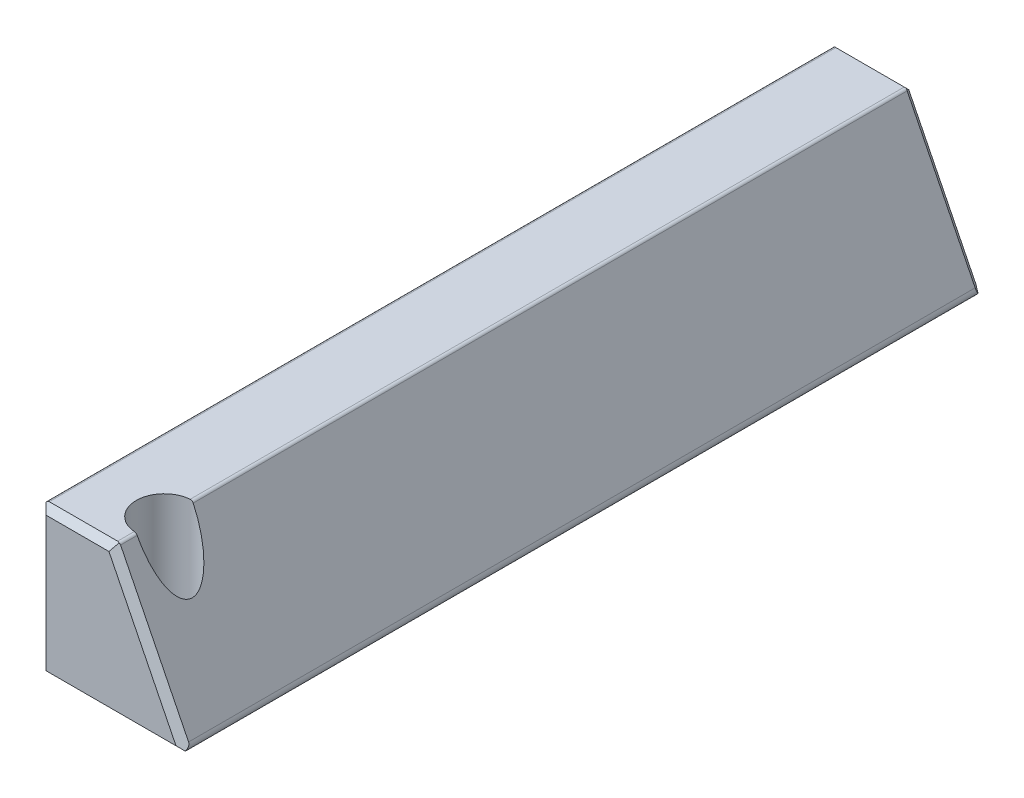
ISO-10303-21;
HEADER;
FILE_DESCRIPTION(('STEP AP214'),'2;1');
FILE_NAME('part.step','',(''),(''),'','','');
FILE_SCHEMA(('AUTOMOTIVE_DESIGN { 1 0 10303 214 1 1 1 1 }'));
ENDSEC;
DATA;
#1=APPLICATION_CONTEXT('core data for automotive mechanical design processes');
#2=APPLICATION_PROTOCOL_DEFINITION('international standard','automotive_design',2000,#1);
#3=PRODUCT_CONTEXT('',#1,'mechanical');
#4=PRODUCT('Part','Part','',(#3));
#5=PRODUCT_RELATED_PRODUCT_CATEGORY('part','',(#4));
#6=PRODUCT_DEFINITION_FORMATION('','',#4);
#7=PRODUCT_DEFINITION_CONTEXT('part definition',#1,'design');
#8=PRODUCT_DEFINITION('design','',#6,#7);
#9=PRODUCT_DEFINITION_SHAPE('','',#8);
#10=(LENGTH_UNIT() NAMED_UNIT(*) SI_UNIT(.MILLI.,.METRE.));
#11=(NAMED_UNIT(*) PLANE_ANGLE_UNIT() SI_UNIT($,.RADIAN.));
#12=(NAMED_UNIT(*) SI_UNIT($,.STERADIAN.) SOLID_ANGLE_UNIT());
#13=UNCERTAINTY_MEASURE_WITH_UNIT(LENGTH_MEASURE(1.E-05),#10,'distance_accuracy_value','');
#14=(GEOMETRIC_REPRESENTATION_CONTEXT(3) GLOBAL_UNCERTAINTY_ASSIGNED_CONTEXT((#13)) GLOBAL_UNIT_ASSIGNED_CONTEXT((#10,
#11,#12)) REPRESENTATION_CONTEXT('',''));
#15=CARTESIAN_POINT('',(0.,0.,0.));
#16=DIRECTION('',(0.,0.,1.));
#17=DIRECTION('',(1.,0.,0.));
#18=AXIS2_PLACEMENT_3D('',#15,#16,#17);
#19=CARTESIAN_POINT('',(5.39518119490849,10.9,60.25));
#20=DIRECTION('',(0.,0.,-1.));
#21=DIRECTION('',(-1.,0.,0.));
#22=AXIS2_PLACEMENT_3D('',#19,#20,#21);
#23=CYLINDRICAL_SURFACE('',#22,0.25);
#24=CARTESIAN_POINT('',(5.61898835620415,11.0114017708691,54.2811281198925));
#25=CARTESIAN_POINT('',(5.61273756244487,11.0239863047052,54.2809243798264));
#26=CARTESIAN_POINT('',(5.60540711729358,11.0360296758708,54.2807114801354));
#27=CARTESIAN_POINT('',(5.58884381534372,11.0587143618956,54.2803411660567));
#28=CARTESIAN_POINT('',(5.5796125467566,11.0693568351677,54.2801837056431));
#29=CARTESIAN_POINT('',(5.55948873102792,11.0889463722493,54.2799974487603));
#30=CARTESIAN_POINT('',(5.54859543904155,11.0978926718579,54.2799687101547));
#31=CARTESIAN_POINT('',(5.5254615316477,11.1138322177729,54.2801110346833));
#32=CARTESIAN_POINT('',(5.51322071703151,11.1208251747682,54.2802821273952));
#33=CARTESIAN_POINT('',(5.4877692770646,11.1326458964287,54.2808795231473));
#34=CARTESIAN_POINT('',(5.47456050955014,11.137477688678,54.2813053479715));
#35=CARTESIAN_POINT('',(5.44754755129671,11.1448531933859,54.2824457905319));
#36=CARTESIAN_POINT('',(5.43374425087326,11.1474002104603,54.2831599889981));
#37=CARTESIAN_POINT('',(5.41164206903695,11.149594976489,54.2845245651528));
#38=CARTESIAN_POINT('',(5.40340740909993,11.1500033691288,54.2850809899192));
#39=CARTESIAN_POINT('',(5.39518119490849,11.15,54.2856874905114));
#40=B_SPLINE_CURVE_WITH_KNOTS('',3,(#24,#25,#26,#27,#28,#29,#30,#31,#32,#33,#34,#35,#36,#37,#38,
#39),.UNSPECIFIED.,.F.,.F.,(4,2,2,2,2,2,2,4),(0.,0.04210341287999,0.0841717884491808,
0.12625907286941,0.168352587568771,0.210367325836084,0.252321197070489,0.277068942626386),.UNSPECIFIED.);
#41=CARTESIAN_POINT('',(5.61898835620415,11.0114017708691,54.2811281198925));
#42=VERTEX_POINT('',#41);
#43=CARTESIAN_POINT('',(5.39518119490849,11.15,54.2856874905114));
#44=VERTEX_POINT('',#43);
#45=EDGE_CURVE('E14',#42,#44,#40,.T.);
#46=ORIENTED_EDGE('',*,*,#45,.F.);
#47=DIRECTION('',(0.,0.,-1.));
#48=VECTOR('',#47,1.);
#49=CARTESIAN_POINT('',(5.61898835620415,11.0114017708691,60.25));
#50=LINE('',#49,#48);
#51=CARTESIAN_POINT('',(5.61898835620415,11.0114017708691,0.5));
#52=VERTEX_POINT('',#51);
#53=EDGE_CURVE('E216',#52,#42,#50,.F.);
#54=ORIENTED_EDGE('',*,*,#53,.F.);
#55=CARTESIAN_POINT('',(5.39518119490849,10.9,0.25));
#56=DIRECTION('',(-0.633022245721076,-0.315091790471029,0.707106781186552));
#57=DIRECTION('',(-0.633022245721084,-0.315091790471033,-0.707106781186543));
#58=AXIS2_PLACEMENT_3D('',#55,#56,#57);
#59=ELLIPSE('',#58,0.353553390593272,0.25);
#60=CARTESIAN_POINT('',(5.52680481984474,11.1125446338034,0.462544633803449));
#61=VERTEX_POINT('',#60);
#62=EDGE_CURVE('E212',#61,#52,#59,.F.);
#63=ORIENTED_EDGE('',*,*,#62,.F.);
#64=CARTESIAN_POINT('',(5.39518119490849,10.9,0.25));
#65=DIRECTION('',(0.,-0.707106781186542,0.707106781186552));
#66=DIRECTION('',(0.,-0.707106781186552,-0.707106781186543));
#67=AXIS2_PLACEMENT_3D('',#64,#65,#66);
#68=ELLIPSE('',#67,0.353553390593271,0.25);
#69=CARTESIAN_POINT('',(5.39518119490849,11.15,0.5));
#70=VERTEX_POINT('',#69);
#71=EDGE_CURVE('E199',#70,#61,#68,.F.);
#72=ORIENTED_EDGE('',*,*,#71,.F.);
#73=DIRECTION('',(0.,0.,-1.));
#74=VECTOR('',#73,1.);
#75=CARTESIAN_POINT('',(5.39518119490849,11.15,60.25));
#76=LINE('',#75,#74);
#77=EDGE_CURVE('E191',#44,#70,#76,.T.);
#78=ORIENTED_EDGE('',*,*,#77,.F.);
#79=EDGE_LOOP('',(#46,#54,#63,#72,#78));
#80=FACE_BOUND('',#79,.T.);
#81=ADVANCED_FACE('F51',(#80),#23,.T.);
#82=CARTESIAN_POINT('',(5.55,11.15,60.25));
#83=DIRECTION('',(0.,-1.,0.));
#84=DIRECTION('',(1.,0.,0.));
#85=AXIS2_PLACEMENT_3D('',#82,#83,#84);
#86=PLANE('',#85);
#87=CARTESIAN_POINT('',(5.39518119490849,11.15,59.75));
#88=VERTEX_POINT('',#87);
#89=CARTESIAN_POINT('',(5.39518119490849,11.15,58.4943125094886));
#90=VERTEX_POINT('',#89);
#91=EDGE_CURVE('E195',#88,#90,#76,.T.);
#92=ORIENTED_EDGE('',*,*,#91,.T.);
#93=CARTESIAN_POINT('',(5.55,11.15,56.39));
#94=DIRECTION('',(0.,1.,0.));
#95=DIRECTION('',(-1.,0.,0.));
#96=AXIS2_PLACEMENT_3D('',#93,#94,#95);
#97=CIRCLE('',#96,2.11);
#98=EDGE_CURVE('E69',#44,#90,#97,.T.);
#99=ORIENTED_EDGE('',*,*,#98,.F.);
#100=ORIENTED_EDGE('',*,*,#77,.T.);
#101=DIRECTION('',(-1.,0.,0.));
#102=VECTOR('',#101,1.);
#103=CARTESIAN_POINT('',(5.55,11.15,0.5));
#104=LINE('',#103,#102);
#105=CARTESIAN_POINT('',(0.250000000000005,11.15,0.5));
#106=VERTEX_POINT('',#105);
#107=EDGE_CURVE('E421',#70,#106,#104,.T.);
#108=ORIENTED_EDGE('',*,*,#107,.T.);
#109=DIRECTION('',(0.,0.,-1.));
#110=VECTOR('',#109,1.);
#111=CARTESIAN_POINT('',(0.250000000000005,11.15,60.25));
#112=LINE('',#111,#110);
#113=CARTESIAN_POINT('',(0.250000000000005,11.15,59.75));
#114=VERTEX_POINT('',#113);
#115=EDGE_CURVE('E203',#106,#114,#112,.F.);
#116=ORIENTED_EDGE('',*,*,#115,.T.);
#117=DIRECTION('',(1.,0.,0.));
#118=VECTOR('',#117,1.);
#119=CARTESIAN_POINT('',(5.55,11.15,59.75));
#120=LINE('',#119,#118);
#121=EDGE_CURVE('E413',#114,#88,#120,.T.);
#122=ORIENTED_EDGE('',*,*,#121,.T.);
#123=EDGE_LOOP('',(#92,#99,#100,#108,#116,#122));
#124=FACE_BOUND('',#123,.T.);
#125=ADVANCED_FACE('F189',(#124),#86,.F.);
#126=CARTESIAN_POINT('',(0.,11.15,60.25));
#127=DIRECTION('',(1.,0.,0.));
#128=DIRECTION('',(0.,1.,0.));
#129=AXIS2_PLACEMENT_3D('',#126,#127,#128);
#130=PLANE('',#129);
#131=DIRECTION('',(0.,-1.,0.));
#132=VECTOR('',#131,1.);
#133=CARTESIAN_POINT('',(0.,11.15,0.5));
#134=LINE('',#133,#132);
#135=CARTESIAN_POINT('',(0.,10.9,0.5));
#136=VERTEX_POINT('',#135);
#137=CARTESIAN_POINT('',(0.,0.25,0.5));
#138=VERTEX_POINT('',#137);
#139=EDGE_CURVE('E501',#136,#138,#134,.T.);
#140=ORIENTED_EDGE('',*,*,#139,.T.);
#141=DIRECTION('',(0.,0.,-1.));
#142=VECTOR('',#141,1.);
#143=CARTESIAN_POINT('',(0.,0.25,60.25));
#144=LINE('',#143,#142);
#145=CARTESIAN_POINT('',(0.,0.25,59.75));
#146=VERTEX_POINT('',#145);
#147=EDGE_CURVE('E464',#138,#146,#144,.F.);
#148=ORIENTED_EDGE('',*,*,#147,.T.);
#149=DIRECTION('',(0.,1.,0.));
#150=VECTOR('',#149,1.);
#151=CARTESIAN_POINT('',(0.,11.15,59.75));
#152=LINE('',#151,#150);
#153=CARTESIAN_POINT('',(0.,10.9,59.75));
#154=VERTEX_POINT('',#153);
#155=EDGE_CURVE('E445',#146,#154,#152,.T.);
#156=ORIENTED_EDGE('',*,*,#155,.T.);
#157=DIRECTION('',(0.,0.,-1.));
#158=VECTOR('',#157,1.);
#159=CARTESIAN_POINT('',(0.,10.9,60.25));
#160=LINE('',#159,#158);
#161=EDGE_CURVE('E461',#154,#136,#160,.T.);
#162=ORIENTED_EDGE('',*,*,#161,.T.);
#163=EDGE_LOOP('',(#140,#148,#156,#162));
#164=FACE_BOUND('',#163,.T.);
#165=ADVANCED_FACE('F257',(#164),#130,.F.);
#166=CARTESIAN_POINT('',(0.,0.,60.25));
#167=DIRECTION('',(0.,1.,0.));
#168=DIRECTION('',(0.,0.,1.));
#169=AXIS2_PLACEMENT_3D('',#166,#167,#168);
#170=PLANE('',#169);
#171=CARTESIAN_POINT('',(5.55000000000001,0.,56.39));
#172=DIRECTION('',(0.,1.,0.));
#173=DIRECTION('',(-1.,0.,0.));
#174=AXIS2_PLACEMENT_3D('',#171,#172,#173);
#175=CIRCLE('',#174,2.11);
#176=CARTESIAN_POINT('',(3.44000000000001,0.,56.39));
#177=VERTEX_POINT('',#176);
#178=EDGE_CURVE('E196',#177,#177,#175,.T.);
#179=ORIENTED_EDGE('',*,*,#178,.T.);
#180=EDGE_LOOP('',(#179));
#181=FACE_BOUND('',#180,.T.);
#182=DIRECTION('',(1.,0.,0.));
#183=VECTOR('',#182,1.);
#184=CARTESIAN_POINT('',(0.,0.,0.5));
#185=LINE('',#184,#183);
#186=CARTESIAN_POINT('',(0.25,0.,0.5));
#187=VERTEX_POINT('',#186);
#188=CARTESIAN_POINT('',(10.2926045422834,0.,0.5));
#189=VERTEX_POINT('',#188);
#190=EDGE_CURVE('E411',#187,#189,#185,.T.);
#191=ORIENTED_EDGE('',*,*,#190,.T.);
#192=DIRECTION('',(0.,0.,-1.));
#193=VECTOR('',#192,1.);
#194=CARTESIAN_POINT('',(10.2926045422834,0.,60.25));
#195=LINE('',#194,#193);
#196=CARTESIAN_POINT('',(10.2926045422834,0.,59.75));
#197=VERTEX_POINT('',#196);
#198=EDGE_CURVE('E227',#189,#197,#195,.F.);
#199=ORIENTED_EDGE('',*,*,#198,.T.);
#200=DIRECTION('',(-1.,0.,0.));
#201=VECTOR('',#200,1.);
#202=CARTESIAN_POINT('',(0.,0.,59.75));
#203=LINE('',#202,#201);
#204=CARTESIAN_POINT('',(0.25,0.,59.75));
#205=VERTEX_POINT('',#204);
#206=EDGE_CURVE('E416',#197,#205,#203,.T.);
#207=ORIENTED_EDGE('',*,*,#206,.T.);
#208=DIRECTION('',(0.,0.,-1.));
#209=VECTOR('',#208,1.);
#210=CARTESIAN_POINT('',(0.25,0.,60.25));
#211=LINE('',#210,#209);
#212=EDGE_CURVE('E433',#205,#187,#211,.T.);
#213=ORIENTED_EDGE('',*,*,#212,.T.);
#214=EDGE_LOOP('',(#191,#199,#207,#213));
#215=FACE_BOUND('',#214,.T.);
#216=ADVANCED_FACE('F253',(#181,#215),#170,.F.);
#217=CARTESIAN_POINT('',(11.1,0.,60.25));
#218=DIRECTION('',(-0.895228645182626,-0.445607083476554,0.));
#219=DIRECTION('',(0.445607083476554,-0.895228645182626,0.));
#220=AXIS2_PLACEMENT_3D('',#217,#218,#219);
#221=PLANE('',#220);
#222=ORIENTED_EDGE('',*,*,#53,.T.);
#223=CARTESIAN_POINT('',(5.55,11.15,56.39));
#224=DIRECTION('',(-0.895228645182626,-0.445607083476554,0.));
#225=DIRECTION('',(-0.445607083476554,0.895228645182626,0.));
#226=AXIS2_PLACEMENT_3D('',#223,#224,#225);
#227=ELLIPSE('',#226,4.73511323818761,2.11);
#228=CARTESIAN_POINT('',(5.61898835620415,11.0114017708691,58.4988718801075));
#229=VERTEX_POINT('',#228);
#230=EDGE_CURVE('E182',#42,#229,#227,.T.);
#231=ORIENTED_EDGE('',*,*,#230,.T.);
#232=CARTESIAN_POINT('',(5.61898835620415,11.0114017708691,59.75));
#233=VERTEX_POINT('',#232);
#234=EDGE_CURVE('E215',#229,#233,#50,.F.);
#235=ORIENTED_EDGE('',*,*,#234,.T.);
#236=DIRECTION('',(0.445607083476554,-0.895228645182626,0.));
#237=VECTOR('',#236,1.);
#238=CARTESIAN_POINT('',(11.1,0.,59.75));
#239=LINE('',#238,#237);
#240=CARTESIAN_POINT('',(10.7402188648747,0.722803541738277,59.75));
#241=VERTEX_POINT('',#240);
#242=EDGE_CURVE('E404',#233,#241,#239,.T.);
#243=ORIENTED_EDGE('',*,*,#242,.T.);
#244=DIRECTION('',(0.,0.,-1.));
#245=VECTOR('',#244,1.);
#246=CARTESIAN_POINT('',(10.7402188648747,0.722803541738277,60.25));
#247=LINE('',#246,#245);
#248=CARTESIAN_POINT('',(10.7402188648747,0.722803541738277,0.5));
#249=VERTEX_POINT('',#248);
#250=EDGE_CURVE('E220',#241,#249,#247,.T.);
#251=ORIENTED_EDGE('',*,*,#250,.T.);
#252=DIRECTION('',(-0.445607083476554,0.895228645182626,0.));
#253=VECTOR('',#252,1.);
#254=CARTESIAN_POINT('',(11.1,0.,0.5));
#255=LINE('',#254,#253);
#256=EDGE_CURVE('E410',#249,#52,#255,.T.);
#257=ORIENTED_EDGE('',*,*,#256,.T.);
#258=EDGE_LOOP('',(#222,#231,#235,#243,#251,#257));
#259=FACE_BOUND('',#258,.T.);
#260=ADVANCED_FACE('F245',(#259),#221,.F.);
#261=CARTESIAN_POINT('',(0.,0.,60.25));
#262=DIRECTION('',(0.,0.,1.));
#263=DIRECTION('',(1.,0.,0.));
#264=AXIS2_PLACEMENT_3D('',#261,#262,#263);
#265=PLANE('',#264);
#266=DIRECTION('',(1.,0.,0.));
#267=VECTOR('',#266,1.);
#268=CARTESIAN_POINT('',(11.1,0.5,60.25));
#269=LINE('',#268,#267);
#270=CARTESIAN_POINT('',(0.500000000000001,0.5,60.25));
#271=VERTEX_POINT('',#270);
#272=CARTESIAN_POINT('',(10.2926045422834,0.5,60.25));
#273=VERTEX_POINT('',#272);
#274=EDGE_CURVE('E428',#271,#273,#269,.T.);
#275=ORIENTED_EDGE('',*,*,#274,.T.);
#276=DIRECTION('',(-0.445607083476554,0.895228645182626,0.));
#277=VECTOR('',#276,1.);
#278=CARTESIAN_POINT('',(5.10238567740869,10.9271964582617,60.25));
#279=LINE('',#278,#277);
#280=CARTESIAN_POINT('',(5.24036238981699,10.65,60.25));
#281=VERTEX_POINT('',#280);
#282=EDGE_CURVE('E430',#273,#281,#279,.T.);
#283=ORIENTED_EDGE('',*,*,#282,.T.);
#284=DIRECTION('',(-1.,0.,0.));
#285=VECTOR('',#284,1.);
#286=CARTESIAN_POINT('',(0.,10.65,60.25));
#287=LINE('',#286,#285);
#288=CARTESIAN_POINT('',(0.500000000000006,10.65,60.25));
#289=VERTEX_POINT('',#288);
#290=EDGE_CURVE('E423',#281,#289,#287,.T.);
#291=ORIENTED_EDGE('',*,*,#290,.T.);
#292=DIRECTION('',(0.,-1.,0.));
#293=VECTOR('',#292,1.);
#294=CARTESIAN_POINT('',(0.5,0.,60.25));
#295=LINE('',#294,#293);
#296=EDGE_CURVE('E426',#289,#271,#295,.T.);
#297=ORIENTED_EDGE('',*,*,#296,.T.);
#298=EDGE_LOOP('',(#275,#283,#291,#297));
#299=FACE_BOUND('',#298,.T.);
#300=ADVANCED_FACE('F240',(#299),#265,.T.);
#301=CARTESIAN_POINT('',(0.,0.,0.));
#302=DIRECTION('',(0.,0.,1.));
#303=DIRECTION('',(1.,0.,0.));
#304=AXIS2_PLACEMENT_3D('',#301,#302,#303);
#305=PLANE('',#304);
#306=DIRECTION('',(-1.,0.,0.));
#307=VECTOR('',#306,1.);
#308=CARTESIAN_POINT('',(0.,0.500000000000007,0.));
#309=LINE('',#308,#307);
#310=CARTESIAN_POINT('',(10.2926045422833,0.500000000000007,0.));
#311=VERTEX_POINT('',#310);
#312=CARTESIAN_POINT('',(0.500000000000008,0.500000000000007,0.));
#313=VERTEX_POINT('',#312);
#314=EDGE_CURVE('E482',#311,#313,#309,.T.);
#315=ORIENTED_EDGE('',*,*,#314,.T.);
#316=DIRECTION('',(0.,1.,0.));
#317=VECTOR('',#316,1.);
#318=CARTESIAN_POINT('',(0.500000000000007,0.,0.));
#319=LINE('',#318,#317);
#320=CARTESIAN_POINT('',(0.500000000000013,10.65,0.));
#321=VERTEX_POINT('',#320);
#322=EDGE_CURVE('E485',#313,#321,#319,.T.);
#323=ORIENTED_EDGE('',*,*,#322,.T.);
#324=DIRECTION('',(1.,0.,0.));
#325=VECTOR('',#324,1.);
#326=CARTESIAN_POINT('',(0.,10.65,0.));
#327=LINE('',#326,#325);
#328=CARTESIAN_POINT('',(5.24036238981698,10.65,0.));
#329=VERTEX_POINT('',#328);
#330=EDGE_CURVE('E488',#321,#329,#327,.T.);
#331=ORIENTED_EDGE('',*,*,#330,.T.);
#332=DIRECTION('',(0.445607083476554,-0.895228645182626,0.));
#333=VECTOR('',#332,1.);
#334=CARTESIAN_POINT('',(8.44830670883495,4.20521096269363,0.));
#335=LINE('',#334,#333);
#336=EDGE_CURVE('E478',#329,#311,#335,.T.);
#337=ORIENTED_EDGE('',*,*,#336,.T.);
#338=EDGE_LOOP('',(#315,#323,#331,#337));
#339=FACE_BOUND('',#338,.T.);
#340=ADVANCED_FACE('F244',(#339),#305,.F.);
#341=CARTESIAN_POINT('',(11.1,0.,0.5));
#342=DIRECTION('',(-0.633022245721076,-0.315091790471029,0.707106781186552));
#343=DIRECTION('',(-0.445607083476554,0.895228645182626,0.));
#344=AXIS2_PLACEMENT_3D('',#341,#342,#343);
#345=PLANE('',#344);
#346=ORIENTED_EDGE('',*,*,#256,.F.);
#347=CARTESIAN_POINT('',(10.2926045422834,0.5,0.));
#348=DIRECTION('',(-0.633022245721076,-0.315091790471029,0.707106781186552));
#349=DIRECTION('',(-0.633022245721084,-0.315091790471033,-0.707106781186543));
#350=AXIS2_PLACEMENT_3D('',#347,#348,#349);
#351=ELLIPSE('',#350,0.707106781186543,0.5);
#352=CARTESIAN_POINT('',(10.7176938098903,0.236752750127508,0.263247249872496));
#353=VERTEX_POINT('',#352);
#354=EDGE_CURVE('E223',#249,#353,#351,.F.);
#355=ORIENTED_EDGE('',*,*,#354,.T.);
#356=DIRECTION('',(-0.752283061319479,0.465870258576247,-0.46587025857624));
#357=VECTOR('',#356,1.);
#358=CARTESIAN_POINT('',(11.1,0.,0.5));
#359=LINE('',#358,#357);
#360=EDGE_CURVE('E440',#311,#353,#359,.F.);
#361=ORIENTED_EDGE('',*,*,#360,.F.);
#362=ORIENTED_EDGE('',*,*,#336,.F.);
#363=DIRECTION('',(-0.401121518355086,-0.647727383824601,-0.647727383824591));
#364=VECTOR('',#363,1.);
#365=CARTESIAN_POINT('',(5.55,11.15,0.500000000000001));
#366=LINE('',#365,#364);
#367=EDGE_CURVE('E443',#61,#329,#366,.T.);
#368=ORIENTED_EDGE('',*,*,#367,.F.);
#369=ORIENTED_EDGE('',*,*,#62,.T.);
#370=EDGE_LOOP('',(#346,#355,#361,#362,#368,#369));
#371=FACE_BOUND('',#370,.T.);
#372=ADVANCED_FACE('F249',(#371),#345,.F.);
#373=CARTESIAN_POINT('',(5.55,11.15,0.5));
#374=DIRECTION('',(0.,-0.707106781186542,0.707106781186552));
#375=DIRECTION('',(-1.,0.,0.));
#376=AXIS2_PLACEMENT_3D('',#373,#374,#375);
#377=PLANE('',#376);
#378=DIRECTION('',(-0.577350269189629,0.577350269189628,0.577350269189621));
#379=VECTOR('',#378,1.);
#380=CARTESIAN_POINT('',(1.85000000000002,9.29999999999998,-1.34999999999999));
#381=LINE('',#380,#379);
#382=CARTESIAN_POINT('',(0.0732233047033689,11.0767766952966,0.426776695296638));
#383=VERTEX_POINT('',#382);
#384=EDGE_CURVE('E437',#383,#321,#381,.F.);
#385=ORIENTED_EDGE('',*,*,#384,.F.);
#386=CARTESIAN_POINT('',(0.250000000000006,10.9,0.25));
#387=DIRECTION('',(0.,-0.707106781186542,0.707106781186552));
#388=DIRECTION('',(0.,-0.707106781186552,-0.707106781186543));
#389=AXIS2_PLACEMENT_3D('',#386,#387,#388);
#390=ELLIPSE('',#389,0.353553390593271,0.25);
#391=EDGE_CURVE('E201',#383,#106,#390,.F.);
#392=ORIENTED_EDGE('',*,*,#391,.T.);
#393=ORIENTED_EDGE('',*,*,#107,.F.);
#394=ORIENTED_EDGE('',*,*,#71,.T.);
#395=ORIENTED_EDGE('',*,*,#367,.T.);
#396=ORIENTED_EDGE('',*,*,#330,.F.);
#397=EDGE_LOOP('',(#385,#392,#393,#394,#395,#396));
#398=FACE_BOUND('',#397,.T.);
#399=ADVANCED_FACE('F272',(#398),#377,.F.);
#400=CARTESIAN_POINT('',(0.,0.,0.5));
#401=DIRECTION('',(0.,0.707106781186542,0.707106781186552));
#402=DIRECTION('',(1.,0.,0.));
#403=AXIS2_PLACEMENT_3D('',#400,#401,#402);
#404=PLANE('',#403);
#405=ORIENTED_EDGE('',*,*,#360,.T.);
#406=CARTESIAN_POINT('',(10.2926045422834,0.5,0.));
#407=DIRECTION('',(0.,0.707106781186542,0.707106781186552));
#408=DIRECTION('',(0.,0.707106781186552,-0.707106781186543));
#409=AXIS2_PLACEMENT_3D('',#406,#407,#408);
#410=ELLIPSE('',#409,0.707106781186543,0.5);
#411=EDGE_CURVE('E225',#353,#189,#410,.F.);
#412=ORIENTED_EDGE('',*,*,#411,.T.);
#413=ORIENTED_EDGE('',*,*,#190,.F.);
#414=CARTESIAN_POINT('',(0.25,0.25,0.25));
#415=DIRECTION('',(0.,0.707106781186542,0.707106781186552));
#416=DIRECTION('',(0.,0.707106781186552,-0.707106781186543));
#417=AXIS2_PLACEMENT_3D('',#414,#415,#416);
#418=ELLIPSE('',#417,0.353553390593271,0.25);
#419=CARTESIAN_POINT('',(0.0732233047033642,0.0732233047033641,0.426776695296637));
#420=VERTEX_POINT('',#419);
#421=EDGE_CURVE('E455',#187,#420,#418,.F.);
#422=ORIENTED_EDGE('',*,*,#421,.T.);
#423=DIRECTION('',(0.577350269189629,0.577350269189628,-0.57735026918962));
#424=VECTOR('',#423,1.);
#425=CARTESIAN_POINT('',(0.,0.,0.5));
#426=LINE('',#425,#424);
#427=EDGE_CURVE('E434',#313,#420,#426,.F.);
#428=ORIENTED_EDGE('',*,*,#427,.F.);
#429=ORIENTED_EDGE('',*,*,#314,.F.);
#430=EDGE_LOOP('',(#405,#412,#413,#422,#428,#429));
#431=FACE_BOUND('',#430,.T.);
#432=ADVANCED_FACE('F268',(#431),#404,.F.);
#433=CARTESIAN_POINT('',(0.,11.15,0.5));
#434=DIRECTION('',(0.707106781186542,0.,0.707106781186552));
#435=DIRECTION('',(0.,-1.,0.));
#436=AXIS2_PLACEMENT_3D('',#433,#434,#435);
#437=PLANE('',#436);
#438=ORIENTED_EDGE('',*,*,#427,.T.);
#439=CARTESIAN_POINT('',(0.25,0.25,0.25));
#440=DIRECTION('',(0.707106781186542,0.,0.707106781186552));
#441=DIRECTION('',(0.707106781186552,0.,-0.707106781186543));
#442=AXIS2_PLACEMENT_3D('',#439,#440,#441);
#443=ELLIPSE('',#442,0.353553390593271,0.25);
#444=EDGE_CURVE('E459',#420,#138,#443,.F.);
#445=ORIENTED_EDGE('',*,*,#444,.T.);
#446=ORIENTED_EDGE('',*,*,#139,.F.);
#447=CARTESIAN_POINT('',(0.250000000000006,10.9,0.25));
#448=DIRECTION('',(0.707106781186542,0.,0.707106781186552));
#449=DIRECTION('',(0.707106781186552,0.,-0.707106781186543));
#450=AXIS2_PLACEMENT_3D('',#447,#448,#449);
#451=ELLIPSE('',#450,0.353553390593271,0.25);
#452=EDGE_CURVE('E457',#136,#383,#451,.F.);
#453=ORIENTED_EDGE('',*,*,#452,.T.);
#454=ORIENTED_EDGE('',*,*,#384,.T.);
#455=ORIENTED_EDGE('',*,*,#322,.F.);
#456=EDGE_LOOP('',(#438,#445,#446,#453,#454,#455));
#457=FACE_BOUND('',#456,.T.);
#458=ADVANCED_FACE('F264',(#457),#437,.F.);
#459=CARTESIAN_POINT('',(0.5,0.,60.25));
#460=DIRECTION('',(-0.707106781186552,0.,0.707106781186542));
#461=DIRECTION('',(0.,1.,0.));
#462=AXIS2_PLACEMENT_3D('',#459,#460,#461);
#463=PLANE('',#462);
#464=ORIENTED_EDGE('',*,*,#155,.F.);
#465=CARTESIAN_POINT('',(0.25,0.25,60.));
#466=DIRECTION('',(-0.707106781186552,0.,0.707106781186542));
#467=DIRECTION('',(-0.707106781186543,0.,-0.707106781186552));
#468=AXIS2_PLACEMENT_3D('',#465,#466,#467);
#469=ELLIPSE('',#468,0.353553390593276,0.25);
#470=CARTESIAN_POINT('',(0.0732233047033625,0.0732233047033624,59.8232233047034));
#471=VERTEX_POINT('',#470);
#472=EDGE_CURVE('E468',#146,#471,#469,.T.);
#473=ORIENTED_EDGE('',*,*,#472,.T.);
#474=DIRECTION('',(0.577350269189623,0.577350269189623,0.577350269189631));
#475=VECTOR('',#474,1.);
#476=CARTESIAN_POINT('',(0.333333333333335,0.333333333333335,60.0833333333333));
#477=LINE('',#476,#475);
#478=EDGE_CURVE('E438',#271,#471,#477,.F.);
#479=ORIENTED_EDGE('',*,*,#478,.F.);
#480=ORIENTED_EDGE('',*,*,#296,.F.);
#481=DIRECTION('',(0.577350269189623,-0.577350269189623,0.577350269189631));
#482=VECTOR('',#481,1.);
#483=CARTESIAN_POINT('',(0.333333333333337,10.8166666666667,60.0833333333333));
#484=LINE('',#483,#482);
#485=CARTESIAN_POINT('',(0.0732233047033665,11.0767766952966,59.8232233047034));
#486=VERTEX_POINT('',#485);
#487=EDGE_CURVE('E449',#486,#289,#484,.T.);
#488=ORIENTED_EDGE('',*,*,#487,.F.);
#489=CARTESIAN_POINT('',(0.250000000000006,10.9,60.));
#490=DIRECTION('',(-0.707106781186552,0.,0.707106781186542));
#491=DIRECTION('',(-0.707106781186543,0.,-0.707106781186552));
#492=AXIS2_PLACEMENT_3D('',#489,#490,#491);
#493=ELLIPSE('',#492,0.353553390593276,0.25);
#494=EDGE_CURVE('E466',#486,#154,#493,.T.);
#495=ORIENTED_EDGE('',*,*,#494,.T.);
#496=EDGE_LOOP('',(#464,#473,#479,#480,#488,#495));
#497=FACE_BOUND('',#496,.T.);
#498=ADVANCED_FACE('F267',(#497),#463,.T.);
#499=CARTESIAN_POINT('',(0.,0.5,60.25));
#500=DIRECTION('',(0.,-0.707106781186552,0.707106781186542));
#501=DIRECTION('',(-1.,0.,0.));
#502=AXIS2_PLACEMENT_3D('',#499,#500,#501);
#503=PLANE('',#502);
#504=ORIENTED_EDGE('',*,*,#206,.F.);
#505=CARTESIAN_POINT('',(10.2926045422834,0.5,60.25));
#506=DIRECTION('',(0.,-0.707106781186552,0.707106781186542));
#507=DIRECTION('',(0.,-0.707106781186543,-0.707106781186552));
#508=AXIS2_PLACEMENT_3D('',#505,#506,#507);
#509=ELLIPSE('',#508,0.707106781186553,0.5);
#510=CARTESIAN_POINT('',(10.7176938098903,0.236752750127508,59.9867527501275));
#511=VERTEX_POINT('',#510);
#512=EDGE_CURVE('E77',#197,#511,#509,.T.);
#513=ORIENTED_EDGE('',*,*,#512,.T.);
#514=DIRECTION('',(-0.752283061319475,0.465870258576244,0.465870258576251));
#515=VECTOR('',#514,1.);
#516=CARTESIAN_POINT('',(4.46771286743554,4.1072110755496,63.8572110755496));
#517=LINE('',#516,#515);
#518=EDGE_CURVE('E407',#273,#511,#517,.F.);
#519=ORIENTED_EDGE('',*,*,#518,.F.);
#520=ORIENTED_EDGE('',*,*,#274,.F.);
#521=ORIENTED_EDGE('',*,*,#478,.T.);
#522=CARTESIAN_POINT('',(0.25,0.25,60.));
#523=DIRECTION('',(0.,-0.707106781186552,0.707106781186542));
#524=DIRECTION('',(0.,-0.707106781186543,-0.707106781186552));
#525=AXIS2_PLACEMENT_3D('',#522,#523,#524);
#526=ELLIPSE('',#525,0.353553390593276,0.25);
#527=EDGE_CURVE('E470',#471,#205,#526,.T.);
#528=ORIENTED_EDGE('',*,*,#527,.T.);
#529=EDGE_LOOP('',(#504,#513,#519,#520,#521,#528));
#530=FACE_BOUND('',#529,.T.);
#531=ADVANCED_FACE('F288',(#530),#503,.T.);
#532=CARTESIAN_POINT('',(0.,10.65,60.25));
#533=DIRECTION('',(0.,0.707106781186552,0.707106781186542));
#534=DIRECTION('',(1.,0.,0.));
#535=AXIS2_PLACEMENT_3D('',#532,#533,#534);
#536=PLANE('',#535);
#537=ORIENTED_EDGE('',*,*,#121,.F.);
#538=CARTESIAN_POINT('',(0.250000000000006,10.9,60.));
#539=DIRECTION('',(0.,0.707106781186552,0.707106781186542));
#540=DIRECTION('',(0.,0.707106781186543,-0.707106781186552));
#541=AXIS2_PLACEMENT_3D('',#538,#539,#540);
#542=ELLIPSE('',#541,0.353553390593276,0.25);
#543=EDGE_CURVE('E210',#114,#486,#542,.T.);
#544=ORIENTED_EDGE('',*,*,#543,.T.);
#545=ORIENTED_EDGE('',*,*,#487,.T.);
#546=ORIENTED_EDGE('',*,*,#290,.F.);
#547=DIRECTION('',(0.40112151835508,0.647727383824593,-0.647727383824602));
#548=VECTOR('',#547,1.);
#549=CARTESIAN_POINT('',(4.39719608601457,9.28846271242038,61.6115372875796));
#550=LINE('',#549,#548);
#551=CARTESIAN_POINT('',(5.52680481984474,11.1125446338034,59.7874553661965));
#552=VERTEX_POINT('',#551);
#553=EDGE_CURVE('E446',#552,#281,#550,.F.);
#554=ORIENTED_EDGE('',*,*,#553,.F.);
#555=CARTESIAN_POINT('',(5.39518119490849,10.9,60.));
#556=DIRECTION('',(0.,0.707106781186552,0.707106781186542));
#557=DIRECTION('',(0.,0.707106781186543,-0.707106781186552));
#558=AXIS2_PLACEMENT_3D('',#555,#556,#557);
#559=ELLIPSE('',#558,0.353553390593276,0.25);
#560=EDGE_CURVE('E208',#552,#88,#559,.T.);
#561=ORIENTED_EDGE('',*,*,#560,.T.);
#562=EDGE_LOOP('',(#537,#544,#545,#546,#554,#561));
#563=FACE_BOUND('',#562,.T.);
#564=ADVANCED_FACE('F284',(#563),#536,.T.);
#565=CARTESIAN_POINT('',(8.44830670883496,4.20521096269363,60.25));
#566=DIRECTION('',(0.633022245721085,0.315091790471034,0.707106781186542));
#567=DIRECTION('',(0.445607083476554,-0.895228645182626,0.));
#568=AXIS2_PLACEMENT_3D('',#565,#566,#567);
#569=PLANE('',#568);
#570=ORIENTED_EDGE('',*,*,#518,.T.);
#571=CARTESIAN_POINT('',(10.2926045422834,0.5,60.25));
#572=DIRECTION('',(0.633022245721085,0.315091790471034,0.707106781186542));
#573=DIRECTION('',(0.633022245721075,0.315091790471029,-0.707106781186553));
#574=AXIS2_PLACEMENT_3D('',#571,#572,#573);
#575=ELLIPSE('',#574,0.707106781186553,0.5);
#576=EDGE_CURVE('E230',#511,#241,#575,.T.);
#577=ORIENTED_EDGE('',*,*,#576,.T.);
#578=ORIENTED_EDGE('',*,*,#242,.F.);
#579=CARTESIAN_POINT('',(5.39518119490849,10.9,60.));
#580=DIRECTION('',(0.633022245721085,0.315091790471034,0.707106781186542));
#581=DIRECTION('',(0.633022245721075,0.315091790471029,-0.707106781186553));
#582=AXIS2_PLACEMENT_3D('',#579,#580,#581);
#583=ELLIPSE('',#582,0.353553390593277,0.25);
#584=EDGE_CURVE('E218',#233,#552,#583,.T.);
#585=ORIENTED_EDGE('',*,*,#584,.T.);
#586=ORIENTED_EDGE('',*,*,#553,.T.);
#587=ORIENTED_EDGE('',*,*,#282,.F.);
#588=EDGE_LOOP('',(#570,#577,#578,#585,#586,#587));
#589=FACE_BOUND('',#588,.T.);
#590=ADVANCED_FACE('F280',(#589),#569,.T.);
#591=CARTESIAN_POINT('',(0.25,0.25,60.25));
#592=DIRECTION('',(0.,0.,-1.));
#593=DIRECTION('',(-1.,0.,0.));
#594=AXIS2_PLACEMENT_3D('',#591,#592,#593);
#595=CYLINDRICAL_SURFACE('',#594,0.25);
#596=ORIENTED_EDGE('',*,*,#472,.F.);
#597=ORIENTED_EDGE('',*,*,#147,.F.);
#598=ORIENTED_EDGE('',*,*,#444,.F.);
#599=ORIENTED_EDGE('',*,*,#421,.F.);
#600=ORIENTED_EDGE('',*,*,#212,.F.);
#601=ORIENTED_EDGE('',*,*,#527,.F.);
#602=EDGE_LOOP('',(#596,#597,#598,#599,#600,#601));
#603=FACE_BOUND('',#602,.T.);
#604=ADVANCED_FACE('F283',(#603),#595,.T.);
#605=CARTESIAN_POINT('',(0.250000000000006,10.9,60.25));
#606=DIRECTION('',(0.,0.,-1.));
#607=DIRECTION('',(-1.,0.,0.));
#608=AXIS2_PLACEMENT_3D('',#605,#606,#607);
#609=CYLINDRICAL_SURFACE('',#608,0.25);
#610=ORIENTED_EDGE('',*,*,#543,.F.);
#611=ORIENTED_EDGE('',*,*,#115,.F.);
#612=ORIENTED_EDGE('',*,*,#391,.F.);
#613=ORIENTED_EDGE('',*,*,#452,.F.);
#614=ORIENTED_EDGE('',*,*,#161,.F.);
#615=ORIENTED_EDGE('',*,*,#494,.F.);
#616=EDGE_LOOP('',(#610,#611,#612,#613,#614,#615));
#617=FACE_BOUND('',#616,.T.);
#618=ADVANCED_FACE('F296',(#617),#609,.T.);
#619=CARTESIAN_POINT('',(5.39518119490849,11.15,58.4943125094886));
#620=CARTESIAN_POINT('',(5.40914331393516,11.1500125261691,58.4953450914569));
#621=CARTESIAN_POINT('',(5.42311361103954,11.1488310511063,58.4962279923982));
#622=CARTESIAN_POINT('',(5.45066399941735,11.1441617529432,58.4977040721006));
#623=CARTESIAN_POINT('',(5.4642444937793,11.1406764090048,58.4982975611022));
#624=CARTESIAN_POINT('',(5.4906464508027,11.1314786027484,58.4992068388605));
#625=CARTESIAN_POINT('',(5.50346756241449,11.1257651195144,58.4995225001024));
#626=CARTESIAN_POINT('',(5.52798038307242,11.1122734116582,58.4999206641484));
#627=CARTESIAN_POINT('',(5.53967183541696,11.1044947192397,58.5000031140778));
#628=CARTESIAN_POINT('',(5.5615975020056,11.0870878011205,58.4999966950741));
#629=CARTESIAN_POINT('',(5.57183069433463,11.0774582893998,58.4999077066289));
#630=CARTESIAN_POINT('',(5.59052880421197,11.056634740504,58.4996315209011));
#631=CARTESIAN_POINT('',(5.59899620488837,11.0454429377933,58.4994444628477));
#632=CARTESIAN_POINT('',(5.61102000261087,11.0264387384317,58.4991222978555));
#633=CARTESIAN_POINT('',(5.61520203302535,11.0190162101564,58.4989954792026));
#634=CARTESIAN_POINT('',(5.61898835620415,11.0114017708691,58.4988718801075));
#635=B_SPLINE_CURVE_WITH_KNOTS('',3,(#619,#620,#621,#622,#623,#624,#625,#626,#627,#628,#629,
#630,#631,#632,#633,#634),.UNSPECIFIED.,.F.,.F.,(4,2,2,2,2,2,2,4),(0.,0.041946032784452,
0.0838470013373131,0.125767191188801,0.16769688461069,0.209655818403651,0.251555343915944,
0.277070578518192),.UNSPECIFIED.);
#636=EDGE_CURVE('E63',#90,#229,#635,.T.);
#637=ORIENTED_EDGE('',*,*,#636,.F.);
#638=ORIENTED_EDGE('',*,*,#91,.F.);
#639=ORIENTED_EDGE('',*,*,#560,.F.);
#640=ORIENTED_EDGE('',*,*,#584,.F.);
#641=ORIENTED_EDGE('',*,*,#234,.F.);
#642=EDGE_LOOP('',(#637,#638,#639,#640,#641));
#643=FACE_BOUND('',#642,.T.);
#644=ADVANCED_FACE('F234',(#643),#23,.T.);
#645=CARTESIAN_POINT('',(10.2926045422834,0.5,60.25));
#646=DIRECTION('',(0.,0.,-1.));
#647=DIRECTION('',(-1.,0.,0.));
#648=AXIS2_PLACEMENT_3D('',#645,#646,#647);
#649=CYLINDRICAL_SURFACE('',#648,0.5);
#650=ORIENTED_EDGE('',*,*,#512,.F.);
#651=ORIENTED_EDGE('',*,*,#198,.F.);
#652=ORIENTED_EDGE('',*,*,#411,.F.);
#653=ORIENTED_EDGE('',*,*,#354,.F.);
#654=ORIENTED_EDGE('',*,*,#250,.F.);
#655=ORIENTED_EDGE('',*,*,#576,.F.);
#656=EDGE_LOOP('',(#650,#651,#652,#653,#654,#655));
#657=FACE_BOUND('',#656,.T.);
#658=ADVANCED_FACE('F53',(#657),#649,.T.);
#659=CARTESIAN_POINT('',(5.55000000000001,0.,56.39));
#660=DIRECTION('',(0.,1.,0.));
#661=DIRECTION('',(-1.,0.,0.));
#662=AXIS2_PLACEMENT_3D('',#659,#660,#661);
#663=CYLINDRICAL_SURFACE('',#662,2.11);
#664=ORIENTED_EDGE('',*,*,#45,.T.);
#665=ORIENTED_EDGE('',*,*,#98,.T.);
#666=ORIENTED_EDGE('',*,*,#636,.T.);
#667=ORIENTED_EDGE('',*,*,#230,.F.);
#668=EDGE_LOOP('',(#664,#665,#666,#667));
#669=FACE_BOUND('',#668,.T.);
#670=ORIENTED_EDGE('',*,*,#178,.F.);
#671=EDGE_LOOP('',(#670));
#672=FACE_BOUND('',#671,.T.);
#673=ADVANCED_FACE('F179',(#669,#672),#663,.F.);
#674=CLOSED_SHELL('',(#81,#125,#165,#216,#260,#300,#340,#372,#399,#432,#458,#498,#531,#564,#590,
#604,#618,#644,#658,#673));
#675=MANIFOLD_SOLID_BREP('B2',#674);
#676=ADVANCED_BREP_SHAPE_REPRESENTATION('',(#18,#675),#14);
#677=SHAPE_DEFINITION_REPRESENTATION(#9,#676);
ENDSEC;
END-ISO-10303-21;
